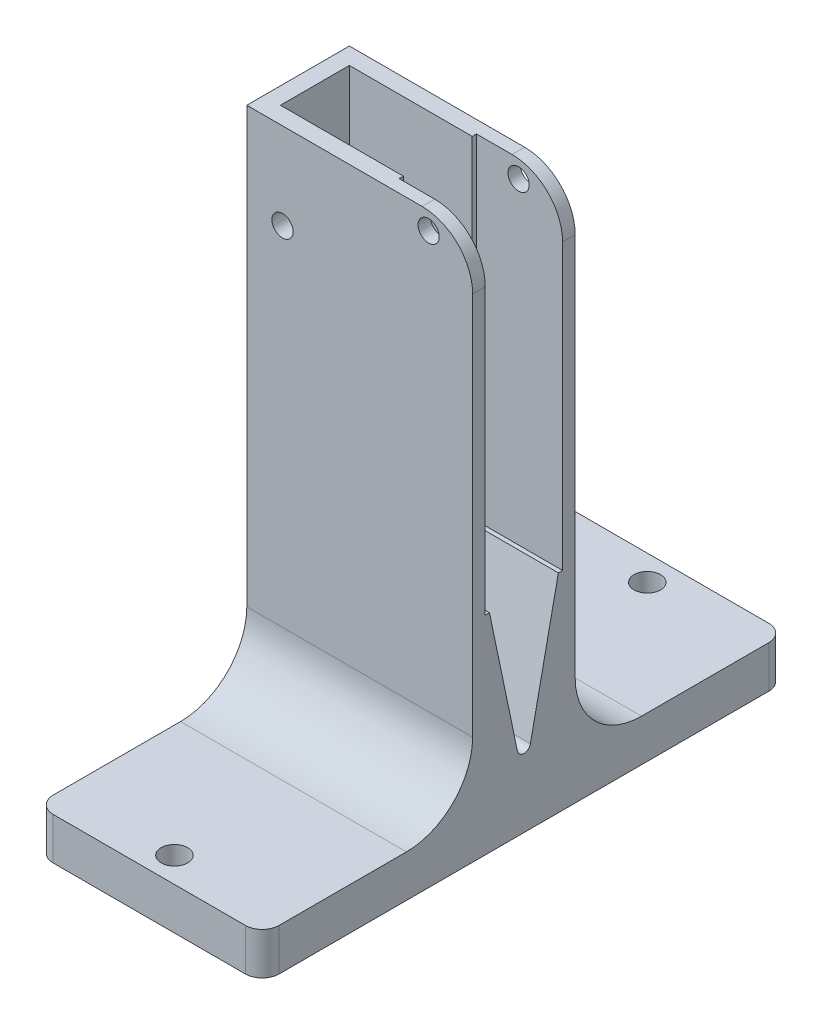
ISO-10303-21;
HEADER;
FILE_DESCRIPTION(('STEP AP214'),'2;1');
FILE_NAME('part.step','',(''),(''),'','','');
FILE_SCHEMA(('AUTOMOTIVE_DESIGN { 1 0 10303 214 1 1 1 1 }'));
ENDSEC;
DATA;
#1=APPLICATION_CONTEXT('core data for automotive mechanical design processes');
#2=APPLICATION_PROTOCOL_DEFINITION('international standard','automotive_design',2000,#1);
#3=PRODUCT_CONTEXT('',#1,'mechanical');
#4=PRODUCT('Part','Part','',(#3));
#5=PRODUCT_RELATED_PRODUCT_CATEGORY('part','',(#4));
#6=PRODUCT_DEFINITION_FORMATION('','',#4);
#7=PRODUCT_DEFINITION_CONTEXT('part definition',#1,'design');
#8=PRODUCT_DEFINITION('design','',#6,#7);
#9=PRODUCT_DEFINITION_SHAPE('','',#8);
#10=(LENGTH_UNIT() NAMED_UNIT(*) SI_UNIT(.MILLI.,.METRE.));
#11=(NAMED_UNIT(*) PLANE_ANGLE_UNIT() SI_UNIT($,.RADIAN.));
#12=(NAMED_UNIT(*) SI_UNIT($,.STERADIAN.) SOLID_ANGLE_UNIT());
#13=UNCERTAINTY_MEASURE_WITH_UNIT(LENGTH_MEASURE(1.E-05),#10,'distance_accuracy_value','');
#14=(GEOMETRIC_REPRESENTATION_CONTEXT(3) GLOBAL_UNCERTAINTY_ASSIGNED_CONTEXT((#13)) GLOBAL_UNIT_ASSIGNED_CONTEXT((#10,
#11,#12)) REPRESENTATION_CONTEXT('',''));
#15=CARTESIAN_POINT('',(0.,0.,0.));
#16=DIRECTION('',(0.,0.,1.));
#17=DIRECTION('',(1.,0.,0.));
#18=AXIS2_PLACEMENT_3D('',#15,#16,#17);
#19=CARTESIAN_POINT('',(4.03999999999999,0.,0.));
#20=DIRECTION('',(1.,0.,0.));
#21=DIRECTION('',(0.,0.,-1.));
#22=AXIS2_PLACEMENT_3D('',#19,#20,#21);
#23=PLANE('',#22);
#24=DIRECTION('',(0.,1.,0.));
#25=VECTOR('',#24,1.);
#26=CARTESIAN_POINT('',(4.03999999999999,81.9,-5.20000000000001));
#27=LINE('',#26,#25);
#28=CARTESIAN_POINT('',(4.03999999999999,31.35,-5.20000000000001));
#29=VERTEX_POINT('',#28);
#30=CARTESIAN_POINT('',(4.03999999999999,81.9,-5.20000000000001));
#31=VERTEX_POINT('',#30);
#32=EDGE_CURVE('E299',#29,#31,#27,.T.);
#33=ORIENTED_EDGE('',*,*,#32,.F.);
#34=DIRECTION('',(0.,0.,-1.));
#35=VECTOR('',#34,1.);
#36=CARTESIAN_POINT('',(4.03999999999999,31.35,0.));
#37=LINE('',#36,#35);
#38=CARTESIAN_POINT('',(4.03999999999999,31.35,-5.835));
#39=VERTEX_POINT('',#38);
#40=EDGE_CURVE('E512',#29,#39,#37,.T.);
#41=ORIENTED_EDGE('',*,*,#40,.T.);
#42=DIRECTION('',(0.,1.,0.));
#43=VECTOR('',#42,1.);
#44=CARTESIAN_POINT('',(4.03999999999999,81.9,-5.835));
#45=LINE('',#44,#43);
#46=CARTESIAN_POINT('',(4.03999999999999,81.9,-5.835));
#47=VERTEX_POINT('',#46);
#48=EDGE_CURVE('E286',#39,#47,#45,.T.);
#49=ORIENTED_EDGE('',*,*,#48,.T.);
#50=DIRECTION('',(0.,0.,1.));
#51=VECTOR('',#50,1.);
#52=CARTESIAN_POINT('',(4.03999999999999,81.9,5.83499999999999));
#53=LINE('',#52,#51);
#54=EDGE_CURVE('E290',#47,#31,#53,.T.);
#55=ORIENTED_EDGE('',*,*,#54,.T.);
#56=EDGE_LOOP('',(#33,#41,#49,#55));
#57=FACE_BOUND('',#56,.T.);
#58=ADVANCED_FACE('F45',(#57),#23,.T.);
#59=CARTESIAN_POINT('',(4.03999999999999,81.9,5.83499999999999));
#60=DIRECTION('',(0.,0.,1.));
#61=DIRECTION('',(1.,0.,0.));
#62=AXIS2_PLACEMENT_3D('',#59,#60,#61);
#63=PLANE('',#62);
#64=CARTESIAN_POINT('',(10.4000003488289,79.200000000021,5.835));
#65=DIRECTION('',(0.,0.,1.));
#66=DIRECTION('',(1.,0.,0.));
#67=AXIS2_PLACEMENT_3D('',#64,#65,#66);
#68=CIRCLE('',#67,1.6);
#69=CARTESIAN_POINT('',(12.0000003488289,79.200000000021,5.835));
#70=VERTEX_POINT('',#69);
#71=EDGE_CURVE('E463',#70,#70,#68,.T.);
#72=ORIENTED_EDGE('',*,*,#71,.T.);
#73=EDGE_LOOP('',(#72));
#74=FACE_BOUND('',#73,.T.);
#75=DIRECTION('',(-1.,0.,0.));
#76=VECTOR('',#75,1.);
#77=CARTESIAN_POINT('',(44.6296520456493,31.35,5.83499999999998));
#78=LINE('',#77,#76);
#79=CARTESIAN_POINT('',(17.04,31.35,5.83499999999998));
#80=VERTEX_POINT('',#79);
#81=CARTESIAN_POINT('',(4.03999999999999,31.35,5.83499999999998));
#82=VERTEX_POINT('',#81);
#83=EDGE_CURVE('E259',#80,#82,#78,.T.);
#84=ORIENTED_EDGE('',*,*,#83,.T.);
#85=DIRECTION('',(0.,-1.,0.));
#86=VECTOR('',#85,1.);
#87=CARTESIAN_POINT('',(4.03999999999999,81.9,5.83499999999999));
#88=LINE('',#87,#86);
#89=CARTESIAN_POINT('',(4.03999999999999,81.9,5.83499999999999));
#90=VERTEX_POINT('',#89);
#91=EDGE_CURVE('E282',#90,#82,#88,.T.);
#92=ORIENTED_EDGE('',*,*,#91,.F.);
#93=DIRECTION('',(1.,0.,0.));
#94=VECTOR('',#93,1.);
#95=CARTESIAN_POINT('',(4.03999999999999,81.9,5.83499999999999));
#96=LINE('',#95,#94);
#97=CARTESIAN_POINT('',(9.41999999999999,81.9,5.83499999999998));
#98=VERTEX_POINT('',#97);
#99=EDGE_CURVE('E297',#90,#98,#96,.T.);
#100=ORIENTED_EDGE('',*,*,#99,.T.);
#101=CARTESIAN_POINT('',(9.41999999999999,74.28,5.83499999999998));
#102=DIRECTION('',(0.,0.,1.));
#103=DIRECTION('',(1.,0.,0.));
#104=AXIS2_PLACEMENT_3D('',#101,#102,#103);
#105=CIRCLE('',#104,7.62);
#106=CARTESIAN_POINT('',(17.04,74.28,5.83499999999998));
#107=VERTEX_POINT('',#106);
#108=EDGE_CURVE('E523',#107,#98,#105,.T.);
#109=ORIENTED_EDGE('',*,*,#108,.F.);
#110=DIRECTION('',(0.,-1.,0.));
#111=VECTOR('',#110,1.);
#112=CARTESIAN_POINT('',(17.04,81.9,5.835));
#113=LINE('',#112,#111);
#114=EDGE_CURVE('E267',#107,#80,#113,.T.);
#115=ORIENTED_EDGE('',*,*,#114,.T.);
#116=EDGE_LOOP('',(#84,#92,#100,#109,#115));
#117=FACE_BOUND('',#116,.T.);
#118=ADVANCED_FACE('F702',(#74,#117),#63,.F.);
#119=CARTESIAN_POINT('',(4.03999999999999,81.9,-5.835));
#120=DIRECTION('',(0.,0.,-1.));
#121=DIRECTION('',(-1.,0.,0.));
#122=AXIS2_PLACEMENT_3D('',#119,#120,#121);
#123=PLANE('',#122);
#124=CARTESIAN_POINT('',(10.4000003488289,79.200000000021,-5.835));
#125=DIRECTION('',(0.,0.,-1.));
#126=DIRECTION('',(-1.,0.,0.));
#127=AXIS2_PLACEMENT_3D('',#124,#125,#126);
#128=CIRCLE('',#127,1.6);
#129=CARTESIAN_POINT('',(8.80000034882888,79.200000000021,-5.835));
#130=VERTEX_POINT('',#129);
#131=EDGE_CURVE('E467',#130,#130,#128,.T.);
#132=ORIENTED_EDGE('',*,*,#131,.T.);
#133=EDGE_LOOP('',(#132));
#134=FACE_BOUND('',#133,.T.);
#135=DIRECTION('',(-1.,0.,0.));
#136=VECTOR('',#135,1.);
#137=CARTESIAN_POINT('',(44.6296520456493,31.35,-5.835));
#138=LINE('',#137,#136);
#139=CARTESIAN_POINT('',(17.04,31.35,-5.835));
#140=VERTEX_POINT('',#139);
#141=EDGE_CURVE('E526',#140,#39,#138,.T.);
#142=ORIENTED_EDGE('',*,*,#141,.F.);
#143=DIRECTION('',(0.,1.,0.));
#144=VECTOR('',#143,1.);
#145=CARTESIAN_POINT('',(17.04,81.9,-5.83499999999999));
#146=LINE('',#145,#144);
#147=CARTESIAN_POINT('',(17.04,74.28,-5.83500000000001));
#148=VERTEX_POINT('',#147);
#149=EDGE_CURVE('E274',#140,#148,#146,.T.);
#150=ORIENTED_EDGE('',*,*,#149,.T.);
#151=CARTESIAN_POINT('',(9.41999999999999,74.28,-5.83500000000001));
#152=DIRECTION('',(0.,0.,-1.));
#153=DIRECTION('',(-1.,0.,0.));
#154=AXIS2_PLACEMENT_3D('',#151,#152,#153);
#155=CIRCLE('',#154,7.62);
#156=CARTESIAN_POINT('',(9.41999999999999,81.9,-5.83500000000001));
#157=VERTEX_POINT('',#156);
#158=EDGE_CURVE('E458',#157,#148,#155,.T.);
#159=ORIENTED_EDGE('',*,*,#158,.F.);
#160=DIRECTION('',(1.,0.,0.));
#161=VECTOR('',#160,1.);
#162=CARTESIAN_POINT('',(4.03999999999999,81.9,-5.835));
#163=LINE('',#162,#161);
#164=EDGE_CURVE('E293',#47,#157,#163,.T.);
#165=ORIENTED_EDGE('',*,*,#164,.F.);
#166=ORIENTED_EDGE('',*,*,#48,.F.);
#167=EDGE_LOOP('',(#142,#150,#159,#165,#166));
#168=FACE_BOUND('',#167,.T.);
#169=ADVANCED_FACE('F695',(#134,#168),#123,.F.);
#170=CARTESIAN_POINT('',(-14.5,81.9,5.2));
#171=DIRECTION('',(0.,0.,-1.));
#172=DIRECTION('',(-1.,0.,0.));
#173=AXIS2_PLACEMENT_3D('',#170,#171,#172);
#174=PLANE('',#173);
#175=CARTESIAN_POINT('',(-11.6500003489543,68.8500000000139,5.2));
#176=DIRECTION('',(0.,0.,-1.));
#177=DIRECTION('',(-1.,0.,0.));
#178=AXIS2_PLACEMENT_3D('',#175,#176,#177);
#179=CIRCLE('',#178,1.6);
#180=CARTESIAN_POINT('',(-13.2500003489543,68.8500000000139,5.2));
#181=VERTEX_POINT('',#180);
#182=EDGE_CURVE('E469',#181,#181,#179,.T.);
#183=ORIENTED_EDGE('',*,*,#182,.F.);
#184=EDGE_LOOP('',(#183));
#185=FACE_BOUND('',#184,.T.);
#186=DIRECTION('',(0.,-1.,0.));
#187=VECTOR('',#186,1.);
#188=CARTESIAN_POINT('',(4.03999999999999,81.9,5.2));
#189=LINE('',#188,#187);
#190=CARTESIAN_POINT('',(4.03999999999999,81.9,5.2));
#191=VERTEX_POINT('',#190);
#192=CARTESIAN_POINT('',(4.03999999999999,31.35,5.2));
#193=VERTEX_POINT('',#192);
#194=EDGE_CURVE('E256',#191,#193,#189,.T.);
#195=ORIENTED_EDGE('',*,*,#194,.T.);
#196=DIRECTION('',(-1.,0.,0.));
#197=VECTOR('',#196,1.);
#198=CARTESIAN_POINT('',(44.6296520456493,31.35,5.2));
#199=LINE('',#198,#197);
#200=CARTESIAN_POINT('',(-9.50000000000001,31.35,5.2));
#201=VERTEX_POINT('',#200);
#202=EDGE_CURVE('E240',#193,#201,#199,.T.);
#203=ORIENTED_EDGE('',*,*,#202,.T.);
#204=DIRECTION('',(0.,-1.,0.));
#205=VECTOR('',#204,1.);
#206=CARTESIAN_POINT('',(-9.50000000000001,65.7,5.2));
#207=LINE('',#206,#205);
#208=CARTESIAN_POINT('',(-9.50000000000001,65.7,5.2));
#209=VERTEX_POINT('',#208);
#210=EDGE_CURVE('E253',#209,#201,#207,.T.);
#211=ORIENTED_EDGE('',*,*,#210,.F.);
#212=DIRECTION('',(1.,0.,0.));
#213=VECTOR('',#212,1.);
#214=CARTESIAN_POINT('',(-14.5,65.7,5.2));
#215=LINE('',#214,#213);
#216=CARTESIAN_POINT('',(-14.5,65.7,5.2));
#217=VERTEX_POINT('',#216);
#218=EDGE_CURVE('E548',#217,#209,#215,.T.);
#219=ORIENTED_EDGE('',*,*,#218,.F.);
#220=DIRECTION('',(0.,-1.,0.));
#221=VECTOR('',#220,1.);
#222=CARTESIAN_POINT('',(-14.5,81.9,5.2));
#223=LINE('',#222,#221);
#224=CARTESIAN_POINT('',(-14.5,81.9,5.2));
#225=VERTEX_POINT('',#224);
#226=EDGE_CURVE('E320',#225,#217,#223,.T.);
#227=ORIENTED_EDGE('',*,*,#226,.F.);
#228=DIRECTION('',(1.,0.,0.));
#229=VECTOR('',#228,1.);
#230=CARTESIAN_POINT('',(-14.5,81.9,5.2));
#231=LINE('',#230,#229);
#232=EDGE_CURVE('E310',#225,#191,#231,.T.);
#233=ORIENTED_EDGE('',*,*,#232,.T.);
#234=EDGE_LOOP('',(#195,#203,#211,#219,#227,#233));
#235=FACE_BOUND('',#234,.T.);
#236=ADVANCED_FACE('F251',(#185,#235),#174,.T.);
#237=CARTESIAN_POINT('',(-14.5,81.9,-5.20000000000001));
#238=DIRECTION('',(0.,0.,1.));
#239=DIRECTION('',(1.,0.,0.));
#240=AXIS2_PLACEMENT_3D('',#237,#238,#239);
#241=PLANE('',#240);
#242=CARTESIAN_POINT('',(-11.6500003489543,68.8500000000139,-5.20000000000001));
#243=DIRECTION('',(0.,0.,1.));
#244=DIRECTION('',(1.,0.,0.));
#245=AXIS2_PLACEMENT_3D('',#242,#243,#244);
#246=CIRCLE('',#245,1.6);
#247=CARTESIAN_POINT('',(-10.0500003489543,68.8500000000139,-5.20000000000001));
#248=VERTEX_POINT('',#247);
#249=EDGE_CURVE('E473',#248,#248,#246,.T.);
#250=ORIENTED_EDGE('',*,*,#249,.F.);
#251=EDGE_LOOP('',(#250));
#252=FACE_BOUND('',#251,.T.);
#253=DIRECTION('',(0.,-1.,0.));
#254=VECTOR('',#253,1.);
#255=CARTESIAN_POINT('',(-9.50000000000001,65.7,-5.20000000000001));
#256=LINE('',#255,#254);
#257=CARTESIAN_POINT('',(-9.50000000000001,65.7,-5.20000000000001));
#258=VERTEX_POINT('',#257);
#259=CARTESIAN_POINT('',(-9.50000000000001,31.35,-5.20000000000001));
#260=VERTEX_POINT('',#259);
#261=EDGE_CURVE('E268',#258,#260,#256,.T.);
#262=ORIENTED_EDGE('',*,*,#261,.T.);
#263=DIRECTION('',(-1.,0.,0.));
#264=VECTOR('',#263,1.);
#265=CARTESIAN_POINT('',(44.6296520456493,31.35,-5.20000000000001));
#266=LINE('',#265,#264);
#267=EDGE_CURVE('E246',#29,#260,#266,.T.);
#268=ORIENTED_EDGE('',*,*,#267,.F.);
#269=ORIENTED_EDGE('',*,*,#32,.T.);
#270=DIRECTION('',(-1.,0.,0.));
#271=VECTOR('',#270,1.);
#272=CARTESIAN_POINT('',(-14.5,81.9,-5.20000000000001));
#273=LINE('',#272,#271);
#274=CARTESIAN_POINT('',(-14.5,81.9,-5.20000000000001));
#275=VERTEX_POINT('',#274);
#276=EDGE_CURVE('E313',#31,#275,#273,.T.);
#277=ORIENTED_EDGE('',*,*,#276,.T.);
#278=DIRECTION('',(0.,-1.,0.));
#279=VECTOR('',#278,1.);
#280=CARTESIAN_POINT('',(-14.5,81.9,-5.20000000000001));
#281=LINE('',#280,#279);
#282=CARTESIAN_POINT('',(-14.5,65.7,-5.20000000000001));
#283=VERTEX_POINT('',#282);
#284=EDGE_CURVE('E316',#275,#283,#281,.T.);
#285=ORIENTED_EDGE('',*,*,#284,.T.);
#286=DIRECTION('',(-1.,0.,0.));
#287=VECTOR('',#286,1.);
#288=CARTESIAN_POINT('',(-14.5,65.7,-5.20000000000001));
#289=LINE('',#288,#287);
#290=EDGE_CURVE('E278',#258,#283,#289,.T.);
#291=ORIENTED_EDGE('',*,*,#290,.F.);
#292=EDGE_LOOP('',(#262,#268,#269,#277,#285,#291));
#293=FACE_BOUND('',#292,.T.);
#294=ADVANCED_FACE('F586',(#252,#293),#241,.T.);
#295=ORIENTED_EDGE('',*,*,#91,.T.);
#296=DIRECTION('',(0.,0.,-1.));
#297=VECTOR('',#296,1.);
#298=CARTESIAN_POINT('',(4.03999999999999,31.35,0.));
#299=LINE('',#298,#297);
#300=EDGE_CURVE('E500',#82,#193,#299,.T.);
#301=ORIENTED_EDGE('',*,*,#300,.T.);
#302=ORIENTED_EDGE('',*,*,#194,.F.);
#303=EDGE_CURVE('E289',#191,#90,#53,.T.);
#304=ORIENTED_EDGE('',*,*,#303,.T.);
#305=EDGE_LOOP('',(#295,#301,#302,#304));
#306=FACE_BOUND('',#305,.T.);
#307=ADVANCED_FACE('F704',(#306),#23,.T.);
#308=CARTESIAN_POINT('',(-9.50000000000001,65.7,-5.20000000000001));
#309=DIRECTION('',(-1.,0.,0.));
#310=DIRECTION('',(0.,0.,1.));
#311=AXIS2_PLACEMENT_3D('',#308,#309,#310);
#312=PLANE('',#311);
#313=DIRECTION('',(0.,0.97888218863758,0.204425196020699));
#314=VECTOR('',#313,1.);
#315=CARTESIAN_POINT('',(-9.50000000000001,31.35,5.2));
#316=LINE('',#315,#314);
#317=CARTESIAN_POINT('',(-9.50000000000001,11.1373397109761,0.978882188637579));
#318=VERTEX_POINT('',#317);
#319=EDGE_CURVE('E235',#318,#201,#316,.T.);
#320=ORIENTED_EDGE('',*,*,#319,.F.);
#321=CARTESIAN_POINT('',(-9.50000000000001,11.3417649069968,0.));
#322=DIRECTION('',(-1.,0.,0.));
#323=DIRECTION('',(0.,0.,1.));
#324=AXIS2_PLACEMENT_3D('',#321,#322,#323);
#325=CIRCLE('',#324,1.);
#326=CARTESIAN_POINT('',(-9.50000000000001,11.1373397109761,-0.978882188637582));
#327=VERTEX_POINT('',#326);
#328=EDGE_CURVE('E68',#318,#327,#325,.F.);
#329=ORIENTED_EDGE('',*,*,#328,.T.);
#330=DIRECTION('',(0.,-0.97888218863758,0.2044251960207));
#331=VECTOR('',#330,1.);
#332=CARTESIAN_POINT('',(-9.50000000000001,6.45,0.));
#333=LINE('',#332,#331);
#334=EDGE_CURVE('E247',#260,#327,#333,.T.);
#335=ORIENTED_EDGE('',*,*,#334,.F.);
#336=ORIENTED_EDGE('',*,*,#261,.F.);
#337=DIRECTION('',(0.,0.,-1.));
#338=VECTOR('',#337,1.);
#339=CARTESIAN_POINT('',(-9.50000000000001,65.7,-5.20000000000001));
#340=LINE('',#339,#338);
#341=EDGE_CURVE('E265',#209,#258,#340,.T.);
#342=ORIENTED_EDGE('',*,*,#341,.F.);
#343=ORIENTED_EDGE('',*,*,#210,.T.);
#344=EDGE_LOOP('',(#320,#329,#335,#336,#342,#343));
#345=FACE_BOUND('',#344,.T.);
#346=ADVANCED_FACE('F262',(#345),#312,.F.);
#347=CARTESIAN_POINT('',(0.,62.5,7.74));
#348=DIRECTION('',(0.,0.,1.));
#349=DIRECTION('',(1.,0.,0.));
#350=AXIS2_PLACEMENT_3D('',#347,#348,#349);
#351=PLANE('',#350);
#352=CARTESIAN_POINT('',(10.4000003488289,79.200000000021,7.74));
#353=DIRECTION('',(0.,0.,1.));
#354=DIRECTION('',(1.,0.,0.));
#355=AXIS2_PLACEMENT_3D('',#352,#353,#354);
#356=CIRCLE('',#355,1.6);
#357=CARTESIAN_POINT('',(12.0000003488289,79.200000000021,7.74));
#358=VERTEX_POINT('',#357);
#359=EDGE_CURVE('E468',#358,#358,#356,.F.);
#360=ORIENTED_EDGE('',*,*,#359,.T.);
#361=EDGE_LOOP('',(#360));
#362=FACE_BOUND('',#361,.T.);
#363=DIRECTION('',(0.,-1.,0.));
#364=VECTOR('',#363,1.);
#365=CARTESIAN_POINT('',(-17.04,62.5,7.74000000000001));
#366=LINE('',#365,#364);
#367=CARTESIAN_POINT('',(-17.04,81.9,7.74));
#368=VERTEX_POINT('',#367);
#369=CARTESIAN_POINT('',(-17.04,16.35,7.74000000000001));
#370=VERTEX_POINT('',#369);
#371=EDGE_CURVE('E384',#368,#370,#366,.T.);
#372=ORIENTED_EDGE('',*,*,#371,.T.);
#373=DIRECTION('',(-1.,0.,0.));
#374=VECTOR('',#373,1.);
#375=CARTESIAN_POINT('',(17.04,16.35,7.74));
#376=LINE('',#375,#374);
#377=CARTESIAN_POINT('',(17.04,16.35,7.74));
#378=VERTEX_POINT('',#377);
#379=EDGE_CURVE('E478',#370,#378,#376,.F.);
#380=ORIENTED_EDGE('',*,*,#379,.T.);
#381=DIRECTION('',(0.,-1.,0.));
#382=VECTOR('',#381,1.);
#383=CARTESIAN_POINT('',(17.04,62.5,7.74));
#384=LINE('',#383,#382);
#385=CARTESIAN_POINT('',(17.04,74.28,7.73999999999999));
#386=VERTEX_POINT('',#385);
#387=EDGE_CURVE('E396',#386,#378,#384,.T.);
#388=ORIENTED_EDGE('',*,*,#387,.F.);
#389=CARTESIAN_POINT('',(9.42,74.28,7.74));
#390=DIRECTION('',(0.,0.,1.));
#391=DIRECTION('',(1.,0.,0.));
#392=AXIS2_PLACEMENT_3D('',#389,#390,#391);
#393=CIRCLE('',#392,7.62);
#394=CARTESIAN_POINT('',(9.42,81.9,7.74));
#395=VERTEX_POINT('',#394);
#396=EDGE_CURVE('E521',#386,#395,#393,.T.);
#397=ORIENTED_EDGE('',*,*,#396,.T.);
#398=DIRECTION('',(1.,0.,0.));
#399=VECTOR('',#398,1.);
#400=CARTESIAN_POINT('',(-17.04,81.9,7.74));
#401=LINE('',#400,#399);
#402=EDGE_CURVE('E327',#368,#395,#401,.T.);
#403=ORIENTED_EDGE('',*,*,#402,.F.);
#404=EDGE_LOOP('',(#372,#380,#388,#397,#403));
#405=FACE_BOUND('',#404,.T.);
#406=CARTESIAN_POINT('',(-11.6500003489543,68.8500000000139,7.74000000000001));
#407=DIRECTION('',(0.,0.,1.));
#408=DIRECTION('',(1.,0.,0.));
#409=AXIS2_PLACEMENT_3D('',#406,#407,#408);
#410=CIRCLE('',#409,1.6);
#411=CARTESIAN_POINT('',(-10.0500003489543,68.8500000000139,7.74000000000001));
#412=VERTEX_POINT('',#411);
#413=EDGE_CURVE('E474',#412,#412,#410,.F.);
#414=ORIENTED_EDGE('',*,*,#413,.T.);
#415=EDGE_LOOP('',(#414));
#416=FACE_BOUND('',#415,.T.);
#417=ADVANCED_FACE('F636',(#362,#405,#416),#351,.T.);
#418=CARTESIAN_POINT('',(0.,62.5,-7.73999999999999));
#419=DIRECTION('',(0.,0.,1.));
#420=DIRECTION('',(1.,0.,0.));
#421=AXIS2_PLACEMENT_3D('',#418,#419,#420);
#422=PLANE('',#421);
#423=CARTESIAN_POINT('',(-11.6500003489543,68.8500000000139,-7.73999999999999));
#424=DIRECTION('',(0.,0.,-1.));
#425=DIRECTION('',(-1.,0.,0.));
#426=AXIS2_PLACEMENT_3D('',#423,#424,#425);
#427=CIRCLE('',#426,1.6);
#428=CARTESIAN_POINT('',(-13.2500003489543,68.8500000000139,-7.73999999999999));
#429=VERTEX_POINT('',#428);
#430=EDGE_CURVE('E510',#429,#429,#427,.T.);
#431=ORIENTED_EDGE('',*,*,#430,.F.);
#432=EDGE_LOOP('',(#431));
#433=FACE_BOUND('',#432,.T.);
#434=CARTESIAN_POINT('',(10.4000003488289,79.200000000021,-7.74));
#435=DIRECTION('',(0.,0.,-1.));
#436=DIRECTION('',(-1.,0.,0.));
#437=AXIS2_PLACEMENT_3D('',#434,#435,#436);
#438=CIRCLE('',#437,1.6);
#439=CARTESIAN_POINT('',(8.80000034882888,79.200000000021,-7.74));
#440=VERTEX_POINT('',#439);
#441=EDGE_CURVE('E560',#440,#440,#438,.T.);
#442=ORIENTED_EDGE('',*,*,#441,.F.);
#443=EDGE_LOOP('',(#442));
#444=FACE_BOUND('',#443,.T.);
#445=DIRECTION('',(0.,-1.,0.));
#446=VECTOR('',#445,1.);
#447=CARTESIAN_POINT('',(17.04,62.5,-7.74));
#448=LINE('',#447,#446);
#449=CARTESIAN_POINT('',(17.04,74.28,-7.74));
#450=VERTEX_POINT('',#449);
#451=CARTESIAN_POINT('',(17.04,16.35,-7.74));
#452=VERTEX_POINT('',#451);
#453=EDGE_CURVE('E392',#450,#452,#448,.T.);
#454=ORIENTED_EDGE('',*,*,#453,.T.);
#455=DIRECTION('',(-1.,0.,0.));
#456=VECTOR('',#455,1.);
#457=CARTESIAN_POINT('',(0.,16.35,-7.73999999999999));
#458=LINE('',#457,#456);
#459=CARTESIAN_POINT('',(-17.04,16.35,-7.73999999999999));
#460=VERTEX_POINT('',#459);
#461=EDGE_CURVE('E481',#452,#460,#458,.T.);
#462=ORIENTED_EDGE('',*,*,#461,.T.);
#463=DIRECTION('',(0.,-1.,0.));
#464=VECTOR('',#463,1.);
#465=CARTESIAN_POINT('',(-17.04,62.5,-7.73999999999999));
#466=LINE('',#465,#464);
#467=CARTESIAN_POINT('',(-17.04,81.9,-7.73999999999999));
#468=VERTEX_POINT('',#467);
#469=EDGE_CURVE('E388',#468,#460,#466,.T.);
#470=ORIENTED_EDGE('',*,*,#469,.F.);
#471=DIRECTION('',(-1.,0.,0.));
#472=VECTOR('',#471,1.);
#473=CARTESIAN_POINT('',(-17.04,81.9,-7.73999999999999));
#474=LINE('',#473,#472);
#475=CARTESIAN_POINT('',(9.41999999999999,81.9,-7.73999999999999));
#476=VERTEX_POINT('',#475);
#477=EDGE_CURVE('E331',#476,#468,#474,.T.);
#478=ORIENTED_EDGE('',*,*,#477,.F.);
#479=CARTESIAN_POINT('',(9.41999999999999,74.28,-7.74));
#480=DIRECTION('',(0.,0.,1.));
#481=DIRECTION('',(1.,0.,0.));
#482=AXIS2_PLACEMENT_3D('',#479,#480,#481);
#483=CIRCLE('',#482,7.62);
#484=EDGE_CURVE('E522',#450,#476,#483,.T.);
#485=ORIENTED_EDGE('',*,*,#484,.F.);
#486=EDGE_LOOP('',(#454,#462,#470,#478,#485));
#487=FACE_BOUND('',#486,.T.);
#488=ADVANCED_FACE('F689',(#433,#444,#487),#422,.F.);
#489=CARTESIAN_POINT('',(-14.5,6.35,-36.95));
#490=DIRECTION('',(0.,-1.,0.));
#491=DIRECTION('',(0.,0.,-1.));
#492=AXIS2_PLACEMENT_3D('',#489,#490,#491);
#493=CYLINDRICAL_SURFACE('',#492,2.54);
#494=CARTESIAN_POINT('',(-14.5,0.,-36.95));
#495=DIRECTION('',(0.,1.,0.));
#496=DIRECTION('',(0.,0.,1.));
#497=AXIS2_PLACEMENT_3D('',#494,#495,#496);
#498=CIRCLE('',#497,2.54);
#499=CARTESIAN_POINT('',(-17.04,0.,-36.95));
#500=VERTEX_POINT('',#499);
#501=CARTESIAN_POINT('',(-14.5,0.,-39.49));
#502=VERTEX_POINT('',#501);
#503=EDGE_CURVE('E428',#500,#502,#498,.F.);
#504=ORIENTED_EDGE('',*,*,#503,.F.);
#505=DIRECTION('',(0.,-1.,0.));
#506=VECTOR('',#505,1.);
#507=CARTESIAN_POINT('',(-17.04,6.35,-36.95));
#508=LINE('',#507,#506);
#509=CARTESIAN_POINT('',(-17.04,6.35,-36.95));
#510=VERTEX_POINT('',#509);
#511=EDGE_CURVE('E455',#510,#500,#508,.T.);
#512=ORIENTED_EDGE('',*,*,#511,.F.);
#513=CARTESIAN_POINT('',(-14.5,6.35,-36.95));
#514=DIRECTION('',(0.,1.,0.));
#515=DIRECTION('',(0.,0.,1.));
#516=AXIS2_PLACEMENT_3D('',#513,#514,#515);
#517=CIRCLE('',#516,2.54);
#518=CARTESIAN_POINT('',(-14.5,6.35,-39.49));
#519=VERTEX_POINT('',#518);
#520=EDGE_CURVE('E405',#510,#519,#517,.F.);
#521=ORIENTED_EDGE('',*,*,#520,.T.);
#522=DIRECTION('',(0.,-1.,0.));
#523=VECTOR('',#522,1.);
#524=CARTESIAN_POINT('',(-14.5,6.35,-39.49));
#525=LINE('',#524,#523);
#526=EDGE_CURVE('E424',#519,#502,#525,.T.);
#527=ORIENTED_EDGE('',*,*,#526,.T.);
#528=EDGE_LOOP('',(#504,#512,#521,#527));
#529=FACE_BOUND('',#528,.T.);
#530=ADVANCED_FACE('F680',(#529),#493,.T.);
#531=CARTESIAN_POINT('',(-17.04,6.35,0.));
#532=DIRECTION('',(-1.,0.,0.));
#533=DIRECTION('',(0.,0.,1.));
#534=AXIS2_PLACEMENT_3D('',#531,#532,#533);
#535=PLANE('',#534);
#536=DIRECTION('',(0.,0.,-1.));
#537=VECTOR('',#536,1.);
#538=CARTESIAN_POINT('',(-17.04,0.,0.));
#539=LINE('',#538,#537);
#540=CARTESIAN_POINT('',(-17.04,0.,36.95));
#541=VERTEX_POINT('',#540);
#542=EDGE_CURVE('E432',#541,#500,#539,.T.);
#543=ORIENTED_EDGE('',*,*,#542,.F.);
#544=DIRECTION('',(0.,-1.,0.));
#545=VECTOR('',#544,1.);
#546=CARTESIAN_POINT('',(-17.04,6.35,36.95));
#547=LINE('',#546,#545);
#548=CARTESIAN_POINT('',(-17.04,6.35,36.95));
#549=VERTEX_POINT('',#548);
#550=EDGE_CURVE('E380',#549,#541,#547,.T.);
#551=ORIENTED_EDGE('',*,*,#550,.F.);
#552=DIRECTION('',(0.,0.,1.));
#553=VECTOR('',#552,1.);
#554=CARTESIAN_POINT('',(-17.04,6.35,0.));
#555=LINE('',#554,#553);
#556=CARTESIAN_POINT('',(-17.04,6.35,17.74));
#557=VERTEX_POINT('',#556);
#558=EDGE_CURVE('E335',#557,#549,#555,.T.);
#559=ORIENTED_EDGE('',*,*,#558,.F.);
#560=CARTESIAN_POINT('',(-17.04,16.35,17.74));
#561=DIRECTION('',(-1.,0.,0.));
#562=DIRECTION('',(0.,0.,1.));
#563=AXIS2_PLACEMENT_3D('',#560,#561,#562);
#564=CIRCLE('',#563,10.);
#565=EDGE_CURVE('E488',#557,#370,#564,.F.);
#566=ORIENTED_EDGE('',*,*,#565,.T.);
#567=ORIENTED_EDGE('',*,*,#371,.F.);
#568=DIRECTION('',(0.,0.,1.));
#569=VECTOR('',#568,1.);
#570=CARTESIAN_POINT('',(-17.04,81.9,-7.73999999999999));
#571=LINE('',#570,#569);
#572=EDGE_CURVE('E323',#468,#368,#571,.T.);
#573=ORIENTED_EDGE('',*,*,#572,.F.);
#574=ORIENTED_EDGE('',*,*,#469,.T.);
#575=CARTESIAN_POINT('',(-17.04,16.35,-17.74));
#576=DIRECTION('',(-1.,0.,0.));
#577=DIRECTION('',(0.,0.,1.));
#578=AXIS2_PLACEMENT_3D('',#575,#576,#577);
#579=CIRCLE('',#578,10.);
#580=CARTESIAN_POINT('',(-17.04,6.35,-17.74));
#581=VERTEX_POINT('',#580);
#582=EDGE_CURVE('E494',#460,#581,#579,.F.);
#583=ORIENTED_EDGE('',*,*,#582,.T.);
#584=DIRECTION('',(0.,0.,-1.));
#585=VECTOR('',#584,1.);
#586=CARTESIAN_POINT('',(-17.04,6.35,0.));
#587=LINE('',#586,#585);
#588=EDGE_CURVE('E410',#581,#510,#587,.T.);
#589=ORIENTED_EDGE('',*,*,#588,.T.);
#590=ORIENTED_EDGE('',*,*,#511,.T.);
#591=EDGE_LOOP('',(#543,#551,#559,#566,#567,#573,#574,#583,#589,#590));
#592=FACE_BOUND('',#591,.T.);
#593=ADVANCED_FACE('F642',(#592),#535,.T.);
#594=CARTESIAN_POINT('',(17.04,6.35,0.));
#595=DIRECTION('',(-1.,0.,0.));
#596=DIRECTION('',(0.,0.,1.));
#597=AXIS2_PLACEMENT_3D('',#594,#595,#596);
#598=PLANE('',#597);
#599=ORIENTED_EDGE('',*,*,#149,.F.);
#600=DIRECTION('',(0.,0.,-1.));
#601=VECTOR('',#600,1.);
#602=CARTESIAN_POINT('',(17.04,31.35,-5.835));
#603=LINE('',#602,#601);
#604=CARTESIAN_POINT('',(17.04,31.35,-5.20000000000001));
#605=VERTEX_POINT('',#604);
#606=EDGE_CURVE('E517',#605,#140,#603,.T.);
#607=ORIENTED_EDGE('',*,*,#606,.F.);
#608=DIRECTION('',(0.,0.97888218863758,-0.2044251960207));
#609=VECTOR('',#608,1.);
#610=CARTESIAN_POINT('',(17.04,6.45,0.));
#611=LINE('',#610,#609);
#612=CARTESIAN_POINT('',(17.04,11.1373397109761,-0.978882188637582));
#613=VERTEX_POINT('',#612);
#614=EDGE_CURVE('E531',#613,#605,#611,.T.);
#615=ORIENTED_EDGE('',*,*,#614,.F.);
#616=CARTESIAN_POINT('',(17.04,11.3417649069968,0.));
#617=DIRECTION('',(-1.,0.,0.));
#618=DIRECTION('',(0.,0.,1.));
#619=AXIS2_PLACEMENT_3D('',#616,#617,#618);
#620=CIRCLE('',#619,1.);
#621=CARTESIAN_POINT('',(17.04,11.1373397109761,0.978882188637578));
#622=VERTEX_POINT('',#621);
#623=EDGE_CURVE('E11',#613,#622,#620,.T.);
#624=ORIENTED_EDGE('',*,*,#623,.T.);
#625=DIRECTION('',(0.,-0.97888218863758,-0.204425196020699));
#626=VECTOR('',#625,1.);
#627=CARTESIAN_POINT('',(17.04,31.35,5.2));
#628=LINE('',#627,#626);
#629=CARTESIAN_POINT('',(17.04,31.35,5.2));
#630=VERTEX_POINT('',#629);
#631=EDGE_CURVE('E530',#630,#622,#628,.T.);
#632=ORIENTED_EDGE('',*,*,#631,.F.);
#633=DIRECTION('',(0.,0.,-1.));
#634=VECTOR('',#633,1.);
#635=CARTESIAN_POINT('',(17.04,31.35,5.2));
#636=LINE('',#635,#634);
#637=EDGE_CURVE('E518',#80,#630,#636,.T.);
#638=ORIENTED_EDGE('',*,*,#637,.F.);
#639=ORIENTED_EDGE('',*,*,#114,.F.);
#640=DIRECTION('',(0.,0.,1.));
#641=VECTOR('',#640,1.);
#642=CARTESIAN_POINT('',(17.04,74.28,-172.380572608602));
#643=LINE('',#642,#641);
#644=EDGE_CURVE('E563',#107,#386,#643,.T.);
#645=ORIENTED_EDGE('',*,*,#644,.T.);
#646=ORIENTED_EDGE('',*,*,#387,.T.);
#647=CARTESIAN_POINT('',(17.04,16.35,17.74));
#648=DIRECTION('',(-1.,0.,0.));
#649=DIRECTION('',(0.,0.,1.));
#650=AXIS2_PLACEMENT_3D('',#647,#648,#649);
#651=CIRCLE('',#650,10.);
#652=CARTESIAN_POINT('',(17.04,6.35,17.74));
#653=VERTEX_POINT('',#652);
#654=EDGE_CURVE('E491',#378,#653,#651,.T.);
#655=ORIENTED_EDGE('',*,*,#654,.T.);
#656=DIRECTION('',(0.,0.,1.));
#657=VECTOR('',#656,1.);
#658=CARTESIAN_POINT('',(17.04,6.35,0.));
#659=LINE('',#658,#657);
#660=CARTESIAN_POINT('',(17.04,6.35,36.95));
#661=VERTEX_POINT('',#660);
#662=EDGE_CURVE('E349',#653,#661,#659,.T.);
#663=ORIENTED_EDGE('',*,*,#662,.T.);
#664=DIRECTION('',(0.,-1.,0.));
#665=VECTOR('',#664,1.);
#666=CARTESIAN_POINT('',(17.04,6.35,36.95));
#667=LINE('',#666,#665);
#668=CARTESIAN_POINT('',(17.04,0.,36.95));
#669=VERTEX_POINT('',#668);
#670=EDGE_CURVE('E356',#661,#669,#667,.T.);
#671=ORIENTED_EDGE('',*,*,#670,.T.);
#672=DIRECTION('',(0.,0.,-1.));
#673=VECTOR('',#672,1.);
#674=CARTESIAN_POINT('',(17.04,0.,0.));
#675=LINE('',#674,#673);
#676=CARTESIAN_POINT('',(17.04,0.,-36.95));
#677=VERTEX_POINT('',#676);
#678=EDGE_CURVE('E436',#669,#677,#675,.T.);
#679=ORIENTED_EDGE('',*,*,#678,.T.);
#680=DIRECTION('',(0.,-1.,0.));
#681=VECTOR('',#680,1.);
#682=CARTESIAN_POINT('',(17.04,6.35,-36.95));
#683=LINE('',#682,#681);
#684=CARTESIAN_POINT('',(17.04,6.35,-36.95));
#685=VERTEX_POINT('',#684);
#686=EDGE_CURVE('E452',#685,#677,#683,.T.);
#687=ORIENTED_EDGE('',*,*,#686,.F.);
#688=DIRECTION('',(0.,0.,-1.));
#689=VECTOR('',#688,1.);
#690=CARTESIAN_POINT('',(17.04,6.35,0.));
#691=LINE('',#690,#689);
#692=CARTESIAN_POINT('',(17.04,6.35,-17.74));
#693=VERTEX_POINT('',#692);
#694=EDGE_CURVE('E413',#693,#685,#691,.T.);
#695=ORIENTED_EDGE('',*,*,#694,.F.);
#696=CARTESIAN_POINT('',(17.04,16.35,-17.74));
#697=DIRECTION('',(-1.,0.,0.));
#698=DIRECTION('',(0.,0.,1.));
#699=AXIS2_PLACEMENT_3D('',#696,#697,#698);
#700=CIRCLE('',#699,10.);
#701=EDGE_CURVE('E497',#693,#452,#700,.T.);
#702=ORIENTED_EDGE('',*,*,#701,.T.);
#703=ORIENTED_EDGE('',*,*,#453,.F.);
#704=EDGE_CURVE('E547',#450,#148,#643,.T.);
#705=ORIENTED_EDGE('',*,*,#704,.T.);
#706=EDGE_LOOP('',(#599,#607,#615,#624,#632,#638,#639,#645,#646,#655,#663,#671,#679,#687,#695,
#702,#703,#705));
#707=FACE_BOUND('',#706,.T.);
#708=ADVANCED_FACE('F625',(#707),#598,.F.);
#709=CARTESIAN_POINT('',(14.5,6.35,-36.95));
#710=DIRECTION('',(0.,-1.,0.));
#711=DIRECTION('',(0.,0.,-1.));
#712=AXIS2_PLACEMENT_3D('',#709,#710,#711);
#713=CYLINDRICAL_SURFACE('',#712,2.54);
#714=CARTESIAN_POINT('',(14.5,0.,-36.95));
#715=DIRECTION('',(0.,1.,0.));
#716=DIRECTION('',(0.,0.,1.));
#717=AXIS2_PLACEMENT_3D('',#714,#715,#716);
#718=CIRCLE('',#717,2.54);
#719=CARTESIAN_POINT('',(14.5,0.,-39.49));
#720=VERTEX_POINT('',#719);
#721=EDGE_CURVE('E440',#720,#677,#718,.F.);
#722=ORIENTED_EDGE('',*,*,#721,.F.);
#723=DIRECTION('',(0.,-1.,0.));
#724=VECTOR('',#723,1.);
#725=CARTESIAN_POINT('',(14.5,6.35,-39.49));
#726=LINE('',#725,#724);
#727=CARTESIAN_POINT('',(14.5,6.35,-39.49));
#728=VERTEX_POINT('',#727);
#729=EDGE_CURVE('E449',#728,#720,#726,.T.);
#730=ORIENTED_EDGE('',*,*,#729,.F.);
#731=CARTESIAN_POINT('',(14.5,6.35,-36.95));
#732=DIRECTION('',(0.,1.,0.));
#733=DIRECTION('',(0.,0.,1.));
#734=AXIS2_PLACEMENT_3D('',#731,#732,#733);
#735=CIRCLE('',#734,2.54);
#736=EDGE_CURVE('E416',#728,#685,#735,.F.);
#737=ORIENTED_EDGE('',*,*,#736,.T.);
#738=ORIENTED_EDGE('',*,*,#686,.T.);
#739=EDGE_LOOP('',(#722,#730,#737,#738));
#740=FACE_BOUND('',#739,.T.);
#741=ADVANCED_FACE('F668',(#740),#713,.T.);
#742=CARTESIAN_POINT('',(-0.0220000000000081,6.35,-35.68));
#743=DIRECTION('',(0.,-1.,0.));
#744=DIRECTION('',(0.,0.,-1.));
#745=AXIS2_PLACEMENT_3D('',#742,#743,#744);
#746=CYLINDRICAL_SURFACE('',#745,1.999996);
#747=CARTESIAN_POINT('',(-0.0220000000000081,6.35,-35.68));
#748=DIRECTION('',(0.,1.,0.));
#749=DIRECTION('',(0.,0.,1.));
#750=AXIS2_PLACEMENT_3D('',#747,#748,#749);
#751=CIRCLE('',#750,1.999996);
#752=CARTESIAN_POINT('',(-0.0220000000000081,6.35,-33.680004));
#753=VERTEX_POINT('',#752);
#754=EDGE_CURVE('E401',#753,#753,#751,.T.);
#755=ORIENTED_EDGE('',*,*,#754,.T.);
#756=EDGE_LOOP('',(#755));
#757=FACE_BOUND('',#756,.T.);
#758=CARTESIAN_POINT('',(-0.0220000000000081,0.,-35.68));
#759=DIRECTION('',(0.,1.,0.));
#760=DIRECTION('',(0.,0.,1.));
#761=AXIS2_PLACEMENT_3D('',#758,#759,#760);
#762=CIRCLE('',#761,1.999996);
#763=CARTESIAN_POINT('',(-0.0220000000000081,0.,-33.680004));
#764=VERTEX_POINT('',#763);
#765=EDGE_CURVE('E400',#764,#764,#762,.T.);
#766=ORIENTED_EDGE('',*,*,#765,.F.);
#767=EDGE_LOOP('',(#766));
#768=FACE_BOUND('',#767,.T.);
#769=ADVANCED_FACE('F756',(#757,#768),#746,.F.);
#770=CARTESIAN_POINT('',(0.,6.35,-39.49));
#771=DIRECTION('',(0.,0.,-1.));
#772=DIRECTION('',(-1.,0.,0.));
#773=AXIS2_PLACEMENT_3D('',#770,#771,#772);
#774=PLANE('',#773);
#775=DIRECTION('',(1.,0.,0.));
#776=VECTOR('',#775,1.);
#777=CARTESIAN_POINT('',(0.,0.,-39.49));
#778=LINE('',#777,#776);
#779=EDGE_CURVE('E406',#502,#720,#778,.T.);
#780=ORIENTED_EDGE('',*,*,#779,.F.);
#781=ORIENTED_EDGE('',*,*,#526,.F.);
#782=DIRECTION('',(1.,0.,0.));
#783=VECTOR('',#782,1.);
#784=CARTESIAN_POINT('',(0.,6.35,-39.49));
#785=LINE('',#784,#783);
#786=EDGE_CURVE('E420',#519,#728,#785,.T.);
#787=ORIENTED_EDGE('',*,*,#786,.T.);
#788=ORIENTED_EDGE('',*,*,#729,.T.);
#789=EDGE_LOOP('',(#780,#781,#787,#788));
#790=FACE_BOUND('',#789,.T.);
#791=ADVANCED_FACE('F676',(#790),#774,.T.);
#792=CARTESIAN_POINT('',(0.,6.35,0.));
#793=DIRECTION('',(0.,1.,0.));
#794=DIRECTION('',(0.,0.,1.));
#795=AXIS2_PLACEMENT_3D('',#792,#793,#794);
#796=PLANE('',#795);
#797=ORIENTED_EDGE('',*,*,#754,.F.);
#798=EDGE_LOOP('',(#797));
#799=FACE_BOUND('',#798,.T.);
#800=ORIENTED_EDGE('',*,*,#588,.F.);
#801=DIRECTION('',(-1.,0.,0.));
#802=VECTOR('',#801,1.);
#803=CARTESIAN_POINT('',(0.,6.35,-17.74));
#804=LINE('',#803,#802);
#805=EDGE_CURVE('E485',#581,#693,#804,.F.);
#806=ORIENTED_EDGE('',*,*,#805,.T.);
#807=ORIENTED_EDGE('',*,*,#694,.T.);
#808=ORIENTED_EDGE('',*,*,#736,.F.);
#809=ORIENTED_EDGE('',*,*,#786,.F.);
#810=ORIENTED_EDGE('',*,*,#520,.F.);
#811=EDGE_LOOP('',(#800,#806,#807,#808,#809,#810));
#812=FACE_BOUND('',#811,.T.);
#813=ADVANCED_FACE('F673',(#799,#812),#796,.T.);
#814=CARTESIAN_POINT('',(0.,0.,0.));
#815=DIRECTION('',(0.,1.,0.));
#816=DIRECTION('',(0.,0.,1.));
#817=AXIS2_PLACEMENT_3D('',#814,#815,#816);
#818=PLANE('',#817);
#819=ORIENTED_EDGE('',*,*,#765,.T.);
#820=EDGE_LOOP('',(#819));
#821=FACE_BOUND('',#820,.T.);
#822=ORIENTED_EDGE('',*,*,#503,.T.);
#823=ORIENTED_EDGE('',*,*,#779,.T.);
#824=ORIENTED_EDGE('',*,*,#721,.T.);
#825=ORIENTED_EDGE('',*,*,#678,.F.);
#826=CARTESIAN_POINT('',(14.5,0.,36.95));
#827=DIRECTION('',(0.,1.,0.));
#828=DIRECTION('',(0.,0.,1.));
#829=AXIS2_PLACEMENT_3D('',#826,#827,#828);
#830=CIRCLE('',#829,2.54);
#831=CARTESIAN_POINT('',(14.5,0.,39.49));
#832=VERTEX_POINT('',#831);
#833=EDGE_CURVE('E362',#832,#669,#830,.T.);
#834=ORIENTED_EDGE('',*,*,#833,.F.);
#835=DIRECTION('',(1.,0.,0.));
#836=VECTOR('',#835,1.);
#837=CARTESIAN_POINT('',(0.,0.,39.49));
#838=LINE('',#837,#836);
#839=CARTESIAN_POINT('',(-14.5,0.,39.49));
#840=VERTEX_POINT('',#839);
#841=EDGE_CURVE('E359',#840,#832,#838,.T.);
#842=ORIENTED_EDGE('',*,*,#841,.F.);
#843=CARTESIAN_POINT('',(-14.5,0.,36.95));
#844=DIRECTION('',(0.,1.,0.));
#845=DIRECTION('',(0.,0.,1.));
#846=AXIS2_PLACEMENT_3D('',#843,#844,#845);
#847=CIRCLE('',#846,2.54);
#848=EDGE_CURVE('E334',#541,#840,#847,.T.);
#849=ORIENTED_EDGE('',*,*,#848,.F.);
#850=ORIENTED_EDGE('',*,*,#542,.T.);
#851=EDGE_LOOP('',(#822,#823,#824,#825,#834,#842,#849,#850));
#852=FACE_BOUND('',#851,.T.);
#853=CARTESIAN_POINT('',(-0.0220000000000081,0.,35.68));
#854=DIRECTION('',(0.,1.,0.));
#855=DIRECTION('',(0.,0.,1.));
#856=AXIS2_PLACEMENT_3D('',#853,#854,#855);
#857=CIRCLE('',#856,1.999996);
#858=CARTESIAN_POINT('',(-0.0220000000000081,0.,37.679996));
#859=VERTEX_POINT('',#858);
#860=EDGE_CURVE('E339',#859,#859,#857,.F.);
#861=ORIENTED_EDGE('',*,*,#860,.F.);
#862=EDGE_LOOP('',(#861));
#863=FACE_BOUND('',#862,.T.);
#864=ADVANCED_FACE('F664',(#821,#852,#863),#818,.F.);
#865=CARTESIAN_POINT('',(-14.5,6.35,36.95));
#866=DIRECTION('',(0.,-1.,0.));
#867=DIRECTION('',(0.,0.,-1.));
#868=AXIS2_PLACEMENT_3D('',#865,#866,#867);
#869=CYLINDRICAL_SURFACE('',#868,2.54);
#870=ORIENTED_EDGE('',*,*,#848,.T.);
#871=DIRECTION('',(0.,-1.,0.));
#872=VECTOR('',#871,1.);
#873=CARTESIAN_POINT('',(-14.5,6.35,39.49));
#874=LINE('',#873,#872);
#875=CARTESIAN_POINT('',(-14.5,6.35,39.49));
#876=VERTEX_POINT('',#875);
#877=EDGE_CURVE('E376',#876,#840,#874,.T.);
#878=ORIENTED_EDGE('',*,*,#877,.F.);
#879=CARTESIAN_POINT('',(-14.5,6.35,36.95));
#880=DIRECTION('',(0.,1.,0.));
#881=DIRECTION('',(0.,0.,1.));
#882=AXIS2_PLACEMENT_3D('',#879,#880,#881);
#883=CIRCLE('',#882,2.54);
#884=EDGE_CURVE('E338',#549,#876,#883,.T.);
#885=ORIENTED_EDGE('',*,*,#884,.F.);
#886=ORIENTED_EDGE('',*,*,#550,.T.);
#887=EDGE_LOOP('',(#870,#878,#885,#886));
#888=FACE_BOUND('',#887,.T.);
#889=ADVANCED_FACE('F738',(#888),#869,.T.);
#890=CARTESIAN_POINT('',(0.,6.35,39.49));
#891=DIRECTION('',(0.,0.,-1.));
#892=DIRECTION('',(-1.,0.,0.));
#893=AXIS2_PLACEMENT_3D('',#890,#891,#892);
#894=PLANE('',#893);
#895=ORIENTED_EDGE('',*,*,#841,.T.);
#896=DIRECTION('',(0.,-1.,0.));
#897=VECTOR('',#896,1.);
#898=CARTESIAN_POINT('',(14.5,6.35,39.49));
#899=LINE('',#898,#897);
#900=CARTESIAN_POINT('',(14.5,6.35,39.49));
#901=VERTEX_POINT('',#900);
#902=EDGE_CURVE('E372',#901,#832,#899,.T.);
#903=ORIENTED_EDGE('',*,*,#902,.F.);
#904=DIRECTION('',(1.,0.,0.));
#905=VECTOR('',#904,1.);
#906=CARTESIAN_POINT('',(0.,6.35,39.49));
#907=LINE('',#906,#905);
#908=EDGE_CURVE('E342',#876,#901,#907,.T.);
#909=ORIENTED_EDGE('',*,*,#908,.F.);
#910=ORIENTED_EDGE('',*,*,#877,.T.);
#911=EDGE_LOOP('',(#895,#903,#909,#910));
#912=FACE_BOUND('',#911,.T.);
#913=ADVANCED_FACE('F735',(#912),#894,.F.);
#914=CARTESIAN_POINT('',(14.5,6.35,36.95));
#915=DIRECTION('',(0.,-1.,0.));
#916=DIRECTION('',(0.,0.,-1.));
#917=AXIS2_PLACEMENT_3D('',#914,#915,#916);
#918=CYLINDRICAL_SURFACE('',#917,2.54);
#919=ORIENTED_EDGE('',*,*,#833,.T.);
#920=ORIENTED_EDGE('',*,*,#670,.F.);
#921=CARTESIAN_POINT('',(14.5,6.35,36.95));
#922=DIRECTION('',(0.,1.,0.));
#923=DIRECTION('',(0.,0.,1.));
#924=AXIS2_PLACEMENT_3D('',#921,#922,#923);
#925=CIRCLE('',#924,2.54);
#926=EDGE_CURVE('E345',#901,#661,#925,.T.);
#927=ORIENTED_EDGE('',*,*,#926,.F.);
#928=ORIENTED_EDGE('',*,*,#902,.T.);
#929=EDGE_LOOP('',(#919,#920,#927,#928));
#930=FACE_BOUND('',#929,.T.);
#931=ADVANCED_FACE('F658',(#930),#918,.T.);
#932=CARTESIAN_POINT('',(-0.0220000000000081,6.35,35.68));
#933=DIRECTION('',(0.,-1.,0.));
#934=DIRECTION('',(0.,0.,-1.));
#935=AXIS2_PLACEMENT_3D('',#932,#933,#934);
#936=CYLINDRICAL_SURFACE('',#935,1.999996);
#937=CARTESIAN_POINT('',(-0.0220000000000081,6.35,35.68));
#938=DIRECTION('',(0.,1.,0.));
#939=DIRECTION('',(0.,0.,1.));
#940=AXIS2_PLACEMENT_3D('',#937,#938,#939);
#941=CIRCLE('',#940,1.999996);
#942=CARTESIAN_POINT('',(-0.0220000000000081,6.35,37.679996));
#943=VERTEX_POINT('',#942);
#944=EDGE_CURVE('E352',#943,#943,#941,.F.);
#945=ORIENTED_EDGE('',*,*,#944,.F.);
#946=EDGE_LOOP('',(#945));
#947=FACE_BOUND('',#946,.T.);
#948=ORIENTED_EDGE('',*,*,#860,.T.);
#949=EDGE_LOOP('',(#948));
#950=FACE_BOUND('',#949,.T.);
#951=ADVANCED_FACE('F729',(#947,#950),#936,.F.);
#952=CARTESIAN_POINT('',(0.,6.35,0.));
#953=DIRECTION('',(0.,1.,0.));
#954=DIRECTION('',(0.,0.,1.));
#955=AXIS2_PLACEMENT_3D('',#952,#953,#954);
#956=PLANE('',#955);
#957=ORIENTED_EDGE('',*,*,#662,.F.);
#958=DIRECTION('',(-1.,0.,0.));
#959=VECTOR('',#958,1.);
#960=CARTESIAN_POINT('',(-17.04,6.35,17.74));
#961=LINE('',#960,#959);
#962=EDGE_CURVE('E462',#653,#557,#961,.T.);
#963=ORIENTED_EDGE('',*,*,#962,.T.);
#964=ORIENTED_EDGE('',*,*,#558,.T.);
#965=ORIENTED_EDGE('',*,*,#884,.T.);
#966=ORIENTED_EDGE('',*,*,#908,.T.);
#967=ORIENTED_EDGE('',*,*,#926,.T.);
#968=EDGE_LOOP('',(#957,#963,#964,#965,#966,#967));
#969=FACE_BOUND('',#968,.T.);
#970=ORIENTED_EDGE('',*,*,#944,.T.);
#971=EDGE_LOOP('',(#970));
#972=FACE_BOUND('',#971,.T.);
#973=ADVANCED_FACE('F651',(#969,#972),#956,.T.);
#974=CARTESIAN_POINT('',(0.,81.9,0.));
#975=DIRECTION('',(0.,1.,0.));
#976=DIRECTION('',(0.,0.,1.));
#977=AXIS2_PLACEMENT_3D('',#974,#975,#976);
#978=PLANE('',#977);
#979=DIRECTION('',(0.,0.,1.));
#980=VECTOR('',#979,1.);
#981=CARTESIAN_POINT('',(9.41999999999998,81.9,-172.380572608602));
#982=LINE('',#981,#980);
#983=EDGE_CURVE('E534',#476,#157,#982,.T.);
#984=ORIENTED_EDGE('',*,*,#983,.F.);
#985=ORIENTED_EDGE('',*,*,#477,.T.);
#986=ORIENTED_EDGE('',*,*,#572,.T.);
#987=ORIENTED_EDGE('',*,*,#402,.T.);
#988=EDGE_CURVE('E536',#98,#395,#982,.T.);
#989=ORIENTED_EDGE('',*,*,#988,.F.);
#990=ORIENTED_EDGE('',*,*,#99,.F.);
#991=ORIENTED_EDGE('',*,*,#303,.F.);
#992=ORIENTED_EDGE('',*,*,#232,.F.);
#993=DIRECTION('',(0.,0.,1.));
#994=VECTOR('',#993,1.);
#995=CARTESIAN_POINT('',(-14.5,81.9,-5.20000000000001));
#996=LINE('',#995,#994);
#997=EDGE_CURVE('E307',#275,#225,#996,.T.);
#998=ORIENTED_EDGE('',*,*,#997,.F.);
#999=ORIENTED_EDGE('',*,*,#276,.F.);
#1000=ORIENTED_EDGE('',*,*,#54,.F.);
#1001=ORIENTED_EDGE('',*,*,#164,.T.);
#1002=EDGE_LOOP('',(#984,#985,#986,#987,#989,#990,#991,#992,#998,#999,#1000,#1001));
#1003=FACE_BOUND('',#1002,.T.);
#1004=ADVANCED_FACE('F596',(#1003),#978,.T.);
#1005=CARTESIAN_POINT('',(-14.5,81.9,-5.20000000000001));
#1006=DIRECTION('',(1.,0.,0.));
#1007=DIRECTION('',(0.,0.,-1.));
#1008=AXIS2_PLACEMENT_3D('',#1005,#1006,#1007);
#1009=PLANE('',#1008);
#1010=DIRECTION('',(0.,0.,1.));
#1011=VECTOR('',#1010,1.);
#1012=CARTESIAN_POINT('',(-14.5,65.7,-5.20000000000001));
#1013=LINE('',#1012,#1011);
#1014=EDGE_CURVE('E549',#283,#217,#1013,.T.);
#1015=ORIENTED_EDGE('',*,*,#1014,.F.);
#1016=ORIENTED_EDGE('',*,*,#284,.F.);
#1017=ORIENTED_EDGE('',*,*,#997,.T.);
#1018=ORIENTED_EDGE('',*,*,#226,.T.);
#1019=EDGE_LOOP('',(#1015,#1016,#1017,#1018));
#1020=FACE_BOUND('',#1019,.T.);
#1021=ADVANCED_FACE('F592',(#1020),#1009,.T.);
#1022=CARTESIAN_POINT('',(0.,65.7,0.));
#1023=DIRECTION('',(0.,1.,0.));
#1024=DIRECTION('',(0.,0.,1.));
#1025=AXIS2_PLACEMENT_3D('',#1022,#1023,#1024);
#1026=PLANE('',#1025);
#1027=ORIENTED_EDGE('',*,*,#1014,.T.);
#1028=ORIENTED_EDGE('',*,*,#218,.T.);
#1029=ORIENTED_EDGE('',*,*,#341,.T.);
#1030=ORIENTED_EDGE('',*,*,#290,.T.);
#1031=EDGE_LOOP('',(#1027,#1028,#1029,#1030));
#1032=FACE_BOUND('',#1031,.T.);
#1033=ADVANCED_FACE('F583',(#1032),#1026,.T.);
#1034=CARTESIAN_POINT('',(9.41999999999998,74.28,-172.380572608602));
#1035=DIRECTION('',(0.,0.,1.));
#1036=DIRECTION('',(1.,0.,0.));
#1037=AXIS2_PLACEMENT_3D('',#1034,#1035,#1036);
#1038=CYLINDRICAL_SURFACE('',#1037,7.62);
#1039=ORIENTED_EDGE('',*,*,#704,.F.);
#1040=ORIENTED_EDGE('',*,*,#484,.T.);
#1041=ORIENTED_EDGE('',*,*,#983,.T.);
#1042=ORIENTED_EDGE('',*,*,#158,.T.);
#1043=EDGE_LOOP('',(#1039,#1040,#1041,#1042));
#1044=FACE_BOUND('',#1043,.T.);
#1045=ADVANCED_FACE('F691',(#1044),#1038,.T.);
#1046=ORIENTED_EDGE('',*,*,#396,.F.);
#1047=ORIENTED_EDGE('',*,*,#644,.F.);
#1048=ORIENTED_EDGE('',*,*,#108,.T.);
#1049=ORIENTED_EDGE('',*,*,#988,.T.);
#1050=EDGE_LOOP('',(#1046,#1047,#1048,#1049));
#1051=FACE_BOUND('',#1050,.T.);
#1052=ADVANCED_FACE('F633',(#1051),#1038,.T.);
#1053=CARTESIAN_POINT('',(10.4000003488289,79.200000000021,-7.74));
#1054=DIRECTION('',(0.,0.,-1.));
#1055=DIRECTION('',(-1.,0.,0.));
#1056=AXIS2_PLACEMENT_3D('',#1053,#1054,#1055);
#1057=CYLINDRICAL_SURFACE('',#1056,1.6);
#1058=ORIENTED_EDGE('',*,*,#359,.F.);
#1059=EDGE_LOOP('',(#1058));
#1060=FACE_BOUND('',#1059,.T.);
#1061=ORIENTED_EDGE('',*,*,#71,.F.);
#1062=EDGE_LOOP('',(#1061));
#1063=FACE_BOUND('',#1062,.T.);
#1064=ADVANCED_FACE('F789',(#1060,#1063),#1057,.F.);
#1065=ORIENTED_EDGE('',*,*,#441,.T.);
#1066=EDGE_LOOP('',(#1065));
#1067=FACE_BOUND('',#1066,.T.);
#1068=ORIENTED_EDGE('',*,*,#131,.F.);
#1069=EDGE_LOOP('',(#1068));
#1070=FACE_BOUND('',#1069,.T.);
#1071=ADVANCED_FACE('F785',(#1067,#1070),#1057,.F.);
#1072=CARTESIAN_POINT('',(-11.6500003489543,68.8500000000139,-7.73999999999999));
#1073=DIRECTION('',(0.,0.,-1.));
#1074=DIRECTION('',(-1.,0.,0.));
#1075=AXIS2_PLACEMENT_3D('',#1072,#1073,#1074);
#1076=CYLINDRICAL_SURFACE('',#1075,1.6);
#1077=ORIENTED_EDGE('',*,*,#182,.T.);
#1078=EDGE_LOOP('',(#1077));
#1079=FACE_BOUND('',#1078,.T.);
#1080=ORIENTED_EDGE('',*,*,#413,.F.);
#1081=EDGE_LOOP('',(#1080));
#1082=FACE_BOUND('',#1081,.T.);
#1083=ADVANCED_FACE('F782',(#1079,#1082),#1076,.F.);
#1084=ORIENTED_EDGE('',*,*,#249,.T.);
#1085=EDGE_LOOP('',(#1084));
#1086=FACE_BOUND('',#1085,.T.);
#1087=ORIENTED_EDGE('',*,*,#430,.T.);
#1088=EDGE_LOOP('',(#1087));
#1089=FACE_BOUND('',#1088,.T.);
#1090=ADVANCED_FACE('F769',(#1086,#1089),#1076,.F.);
#1091=CARTESIAN_POINT('',(0.,16.35,17.74));
#1092=DIRECTION('',(1.,0.,0.));
#1093=DIRECTION('',(0.,0.,-1.));
#1094=AXIS2_PLACEMENT_3D('',#1091,#1092,#1093);
#1095=CYLINDRICAL_SURFACE('',#1094,10.);
#1096=ORIENTED_EDGE('',*,*,#654,.F.);
#1097=ORIENTED_EDGE('',*,*,#379,.F.);
#1098=ORIENTED_EDGE('',*,*,#565,.F.);
#1099=ORIENTED_EDGE('',*,*,#962,.F.);
#1100=EDGE_LOOP('',(#1096,#1097,#1098,#1099));
#1101=FACE_BOUND('',#1100,.T.);
#1102=ADVANCED_FACE('F647',(#1101),#1095,.F.);
#1103=CARTESIAN_POINT('',(0.,16.35,-17.74));
#1104=DIRECTION('',(-1.,0.,0.));
#1105=DIRECTION('',(0.,0.,1.));
#1106=AXIS2_PLACEMENT_3D('',#1103,#1104,#1105);
#1107=CYLINDRICAL_SURFACE('',#1106,10.);
#1108=ORIENTED_EDGE('',*,*,#701,.F.);
#1109=ORIENTED_EDGE('',*,*,#805,.F.);
#1110=ORIENTED_EDGE('',*,*,#582,.F.);
#1111=ORIENTED_EDGE('',*,*,#461,.F.);
#1112=EDGE_LOOP('',(#1108,#1109,#1110,#1111));
#1113=FACE_BOUND('',#1112,.T.);
#1114=ADVANCED_FACE('F684',(#1113),#1107,.F.);
#1115=CARTESIAN_POINT('',(44.6296520456493,31.35,-5.835));
#1116=DIRECTION('',(0.,-1.,0.));
#1117=DIRECTION('',(0.,0.,-1.));
#1118=AXIS2_PLACEMENT_3D('',#1115,#1116,#1117);
#1119=PLANE('',#1118);
#1120=ORIENTED_EDGE('',*,*,#40,.F.);
#1121=EDGE_CURVE('E527',#605,#29,#266,.T.);
#1122=ORIENTED_EDGE('',*,*,#1121,.F.);
#1123=ORIENTED_EDGE('',*,*,#606,.T.);
#1124=ORIENTED_EDGE('',*,*,#141,.T.);
#1125=EDGE_LOOP('',(#1120,#1122,#1123,#1124));
#1126=FACE_BOUND('',#1125,.T.);
#1127=ADVANCED_FACE('F699',(#1126),#1119,.F.);
#1128=CARTESIAN_POINT('',(44.6296520456493,31.35,5.2));
#1129=DIRECTION('',(0.,-1.,0.));
#1130=DIRECTION('',(0.,0.,-1.));
#1131=AXIS2_PLACEMENT_3D('',#1128,#1129,#1130);
#1132=PLANE('',#1131);
#1133=ORIENTED_EDGE('',*,*,#300,.F.);
#1134=ORIENTED_EDGE('',*,*,#83,.F.);
#1135=ORIENTED_EDGE('',*,*,#637,.T.);
#1136=EDGE_CURVE('E258',#630,#193,#199,.T.);
#1137=ORIENTED_EDGE('',*,*,#1136,.T.);
#1138=EDGE_LOOP('',(#1133,#1134,#1135,#1137));
#1139=FACE_BOUND('',#1138,.T.);
#1140=ADVANCED_FACE('F629',(#1139),#1132,.F.);
#1141=CARTESIAN_POINT('',(44.6296520456493,31.35,5.2));
#1142=DIRECTION('',(0.,-0.204425196020699,0.97888218863758));
#1143=DIRECTION('',(0.,-0.97888218863758,-0.204425196020699));
#1144=AXIS2_PLACEMENT_3D('',#1141,#1142,#1143);
#1145=PLANE('',#1144);
#1146=ORIENTED_EDGE('',*,*,#631,.T.);
#1147=DIRECTION('',(-1.,0.,0.));
#1148=VECTOR('',#1147,1.);
#1149=CARTESIAN_POINT('',(-9.50000000000001,11.1373397109761,0.978882188637579));
#1150=LINE('',#1149,#1148);
#1151=EDGE_CURVE('E243',#622,#318,#1150,.T.);
#1152=ORIENTED_EDGE('',*,*,#1151,.T.);
#1153=ORIENTED_EDGE('',*,*,#319,.T.);
#1154=ORIENTED_EDGE('',*,*,#202,.F.);
#1155=ORIENTED_EDGE('',*,*,#1136,.F.);
#1156=EDGE_LOOP('',(#1146,#1152,#1153,#1154,#1155));
#1157=FACE_BOUND('',#1156,.T.);
#1158=ADVANCED_FACE('F238',(#1157),#1145,.F.);
#1159=CARTESIAN_POINT('',(44.6296520456493,6.45,0.));
#1160=DIRECTION('',(0.,-0.2044251960207,-0.97888218863758));
#1161=DIRECTION('',(0.,0.97888218863758,-0.2044251960207));
#1162=AXIS2_PLACEMENT_3D('',#1159,#1160,#1161);
#1163=PLANE('',#1162);
#1164=ORIENTED_EDGE('',*,*,#334,.T.);
#1165=DIRECTION('',(-1.,0.,0.));
#1166=VECTOR('',#1165,1.);
#1167=CARTESIAN_POINT('',(17.04,11.1373397109761,-0.978882188637582));
#1168=LINE('',#1167,#1166);
#1169=EDGE_CURVE('E54',#327,#613,#1168,.F.);
#1170=ORIENTED_EDGE('',*,*,#1169,.T.);
#1171=ORIENTED_EDGE('',*,*,#614,.T.);
#1172=ORIENTED_EDGE('',*,*,#1121,.T.);
#1173=ORIENTED_EDGE('',*,*,#267,.T.);
#1174=EDGE_LOOP('',(#1164,#1170,#1171,#1172,#1173));
#1175=FACE_BOUND('',#1174,.T.);
#1176=ADVANCED_FACE('F621',(#1175),#1163,.F.);
#1177=CARTESIAN_POINT('',(44.6296520456493,11.3417649069968,0.));
#1178=DIRECTION('',(1.,0.,0.));
#1179=DIRECTION('',(0.,0.,-1.));
#1180=AXIS2_PLACEMENT_3D('',#1177,#1178,#1179);
#1181=CYLINDRICAL_SURFACE('',#1180,1.);
#1182=ORIENTED_EDGE('',*,*,#623,.F.);
#1183=ORIENTED_EDGE('',*,*,#1169,.F.);
#1184=ORIENTED_EDGE('',*,*,#328,.F.);
#1185=ORIENTED_EDGE('',*,*,#1151,.F.);
#1186=EDGE_LOOP('',(#1182,#1183,#1184,#1185));
#1187=FACE_BOUND('',#1186,.T.);
#1188=ADVANCED_FACE('F47',(#1187),#1181,.F.);
#1189=CLOSED_SHELL('',(#58,#118,#169,#236,#294,#307,#346,#417,#488,#530,#593,#708,#741,#769,
#791,#813,#864,#889,#913,#931,#951,#973,#1004,#1021,#1033,#1045,#1052,#1064,#1071,#1083,#1090,
#1102,#1114,#1127,#1140,#1158,#1176,#1188));
#1190=MANIFOLD_SOLID_BREP('B2',#1189);
#1191=ADVANCED_BREP_SHAPE_REPRESENTATION('',(#18,#1190),#14);
#1192=SHAPE_DEFINITION_REPRESENTATION(#9,#1191);
ENDSEC;
END-ISO-10303-21;
